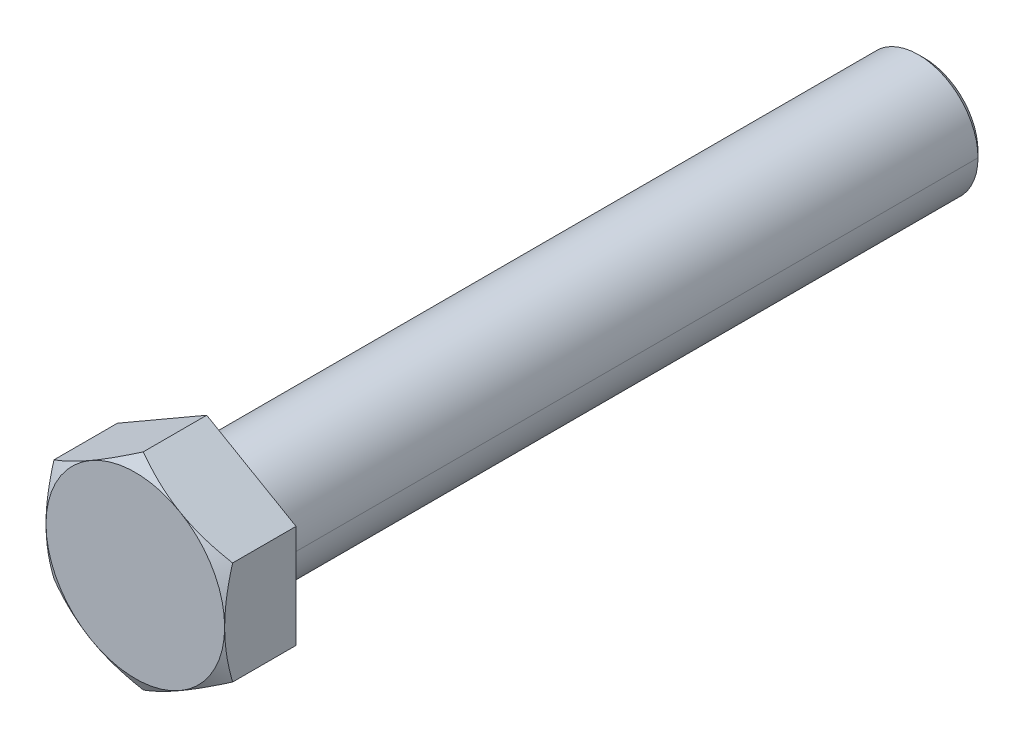
ISO-10303-21;
HEADER;
FILE_DESCRIPTION(('STEP AP214'),'2;1');
FILE_NAME('part.step','',(''),(''),'','','');
FILE_SCHEMA(('AUTOMOTIVE_DESIGN { 1 0 10303 214 1 1 1 1 }'));
ENDSEC;
DATA;
#1=APPLICATION_CONTEXT('core data for automotive mechanical design processes');
#2=APPLICATION_PROTOCOL_DEFINITION('international standard','automotive_design',2000,#1);
#3=PRODUCT_CONTEXT('',#1,'mechanical');
#4=PRODUCT('Part','Part','',(#3));
#5=PRODUCT_RELATED_PRODUCT_CATEGORY('part','',(#4));
#6=PRODUCT_DEFINITION_FORMATION('','',#4);
#7=PRODUCT_DEFINITION_CONTEXT('part definition',#1,'design');
#8=PRODUCT_DEFINITION('design','',#6,#7);
#9=PRODUCT_DEFINITION_SHAPE('','',#8);
#10=(LENGTH_UNIT() NAMED_UNIT(*) SI_UNIT(.MILLI.,.METRE.));
#11=(NAMED_UNIT(*) PLANE_ANGLE_UNIT() SI_UNIT($,.RADIAN.));
#12=(NAMED_UNIT(*) SI_UNIT($,.STERADIAN.) SOLID_ANGLE_UNIT());
#13=UNCERTAINTY_MEASURE_WITH_UNIT(LENGTH_MEASURE(1.E-05),#10,'distance_accuracy_value','');
#14=(GEOMETRIC_REPRESENTATION_CONTEXT(3) GLOBAL_UNCERTAINTY_ASSIGNED_CONTEXT((#13)) GLOBAL_UNIT_ASSIGNED_CONTEXT((#10,
#11,#12)) REPRESENTATION_CONTEXT('',''));
#15=CARTESIAN_POINT('',(0.,0.,0.));
#16=DIRECTION('',(0.,0.,1.));
#17=DIRECTION('',(1.,0.,0.));
#18=AXIS2_PLACEMENT_3D('',#15,#16,#17);
#19=CARTESIAN_POINT('',(0.,0.,4.9609375));
#20=DIRECTION('',(0.,0.,1.));
#21=DIRECTION('',(1.,0.,0.));
#22=AXIS2_PLACEMENT_3D('',#19,#20,#21);
#23=PLANE('',#22);
#24=CARTESIAN_POINT('',(0.,0.,4.96093749999959));
#25=DIRECTION('',(0.,0.,-1.));
#26=DIRECTION('',(-1.,0.,0.));
#27=AXIS2_PLACEMENT_3D('',#24,#25,#26);
#28=CIRCLE('',#27,11.9062499999994);
#29=CARTESIAN_POINT('',(5.95312500053961,10.3111149634961,4.96093749999942));
#30=VERTEX_POINT('',#29);
#31=CARTESIAN_POINT('',(11.90625,-7.6982950199659E-10,4.96093749999941));
#32=VERTEX_POINT('',#31);
#33=EDGE_CURVE('E359',#30,#32,#28,.T.);
#34=ORIENTED_EDGE('',*,*,#33,.F.);
#35=CARTESIAN_POINT('',(0.,0.,4.96093749999922));
#36=DIRECTION('',(0.,0.,-1.));
#37=DIRECTION('',(-1.,0.,0.));
#38=AXIS2_PLACEMENT_3D('',#35,#36,#37);
#39=CIRCLE('',#38,11.90625);
#40=CARTESIAN_POINT('',(-5.95312499930668,10.311114964209,4.96093749999932));
#41=VERTEX_POINT('',#40);
#42=EDGE_CURVE('E358',#41,#30,#39,.T.);
#43=ORIENTED_EDGE('',*,*,#42,.F.);
#44=CARTESIAN_POINT('',(0.,0.,4.96093749999942));
#45=DIRECTION('',(0.,0.,-1.));
#46=DIRECTION('',(-1.,0.,0.));
#47=AXIS2_PLACEMENT_3D('',#44,#45,#46);
#48=CIRCLE('',#47,11.9062499999997);
#49=CARTESIAN_POINT('',(-11.9062499999998,7.69728898675215E-10,4.96093749999951));
#50=VERTEX_POINT('',#49);
#51=EDGE_CURVE('E101',#50,#41,#48,.T.);
#52=ORIENTED_EDGE('',*,*,#51,.F.);
#53=CARTESIAN_POINT('',(0.,0.,4.96093749999959));
#54=DIRECTION('',(0.,0.,-1.));
#55=DIRECTION('',(-1.,0.,0.));
#56=AXIS2_PLACEMENT_3D('',#53,#54,#55);
#57=CIRCLE('',#56,11.9062499999994);
#58=CARTESIAN_POINT('',(-5.95312500053961,-10.3111149634961,4.96093749999942));
#59=VERTEX_POINT('',#58);
#60=EDGE_CURVE('E19',#59,#50,#57,.T.);
#61=ORIENTED_EDGE('',*,*,#60,.F.);
#62=CARTESIAN_POINT('',(0.,0.,4.96093749999922));
#63=DIRECTION('',(0.,0.,-1.));
#64=DIRECTION('',(-1.,0.,0.));
#65=AXIS2_PLACEMENT_3D('',#62,#63,#64);
#66=CIRCLE('',#65,11.90625);
#67=CARTESIAN_POINT('',(5.95312499930667,-10.311114964209,4.96093749999932));
#68=VERTEX_POINT('',#67);
#69=EDGE_CURVE('E98',#68,#59,#66,.T.);
#70=ORIENTED_EDGE('',*,*,#69,.F.);
#71=CARTESIAN_POINT('',(0.,0.,4.96093749999942));
#72=DIRECTION('',(0.,0.,-1.));
#73=DIRECTION('',(-1.,0.,0.));
#74=AXIS2_PLACEMENT_3D('',#71,#72,#73);
#75=CIRCLE('',#74,11.9062499999997);
#76=EDGE_CURVE('E115',#32,#68,#75,.T.);
#77=ORIENTED_EDGE('',*,*,#76,.F.);
#78=EDGE_LOOP('',(#34,#43,#52,#61,#70,#77));
#79=FACE_BOUND('',#78,.T.);
#80=ADVANCED_FACE('F16',(#79),#23,.T.);
#81=CARTESIAN_POINT('',(0.,0.,3.89113360239324));
#82=DIRECTION('',(0.,0.,-1.));
#83=DIRECTION('',(-1.,0.,0.));
#84=AXIS2_PLACEMENT_3D('',#81,#82,#83);
#85=CONICAL_SURFACE('',#84,13.7592047047879,1.0471975511964);
#86=CARTESIAN_POINT('',(-5.95312500107936,-10.3111149631845,4.96093749999962));
#87=CARTESIAN_POINT('',(-6.20580166741517,-10.1652320218576,4.96098646364023));
#88=CARTESIAN_POINT('',(-6.45846630148535,-10.0193560273625,4.95474690052679));
#89=CARTESIAN_POINT('',(-6.96329945909345,-9.72789046792157,4.9300532996241));
#90=CARTESIAN_POINT('',(-7.21546807093537,-9.58230085199346,4.91160167991516));
#91=CARTESIAN_POINT('',(-7.7176800958429,-9.29234860422281,4.86296804461421));
#92=CARTESIAN_POINT('',(-7.96772783267053,-9.14798347605512,4.83284508249774));
#93=CARTESIAN_POINT('',(-8.46663310268567,-8.85994038411174,4.76151221670571));
#94=CARTESIAN_POINT('',(-8.7154906043698,-8.71626243852455,4.72030202120574));
#95=CARTESIAN_POINT('',(-9.21145705677026,-8.42991607372211,4.62763505290839));
#96=CARTESIAN_POINT('',(-9.4585677527614,-8.28724664687198,4.57619068363683));
#97=CARTESIAN_POINT('',(-9.95117990716003,-8.00283688692383,4.46390110400395));
#98=CARTESIAN_POINT('',(-10.1966812665478,-7.8610966109949,4.40305532074512));
#99=CARTESIAN_POINT('',(-10.9330831644665,-7.43593477699972,4.20711782103512));
#100=CARTESIAN_POINT('',(-11.4214457036179,-7.15397853355857,4.05909780005811));
#101=CARTESIAN_POINT('',(-11.90625,-6.87407664253805,3.897514142538));
#102=B_SPLINE_CURVE_WITH_KNOTS('',3,(#86,#87,#88,#89,#90,#91,#92,#93,#94,#95,#96,#97,#98,#99,
#100,#101),.UNSPECIFIED.,.F.,.F.,(4,2,2,2,2,2,2,4),(0.,0.875208645584027,1.75024404500986,
2.6209086587924,3.49159619137232,4.36123483481605,5.23092649267389,6.97885128515324),.UNSPECIFIED.);
#103=CARTESIAN_POINT('',(-11.90625,-6.87407664253804,3.897514142538));
#104=VERTEX_POINT('',#103);
#105=EDGE_CURVE('E117',#59,#104,#102,.T.);
#106=ORIENTED_EDGE('',*,*,#105,.F.);
#107=ORIENTED_EDGE('',*,*,#60,.T.);
#108=CARTESIAN_POINT('',(-11.90625,-6.87407664253803,3.897514142538));
#109=CARTESIAN_POINT('',(-11.90625,-6.31427286030369,4.0590978001139));
#110=CARTESIAN_POINT('',(-11.90625,-5.75036037322509,4.20711782113733));
#111=CARTESIAN_POINT('',(-11.90625,-4.90003670493813,4.40305532089693));
#112=CARTESIAN_POINT('',(-11.90625,-4.61655615298187,4.46390110416884));
#113=CARTESIAN_POINT('',(-11.90625,-4.0477366328877,4.57619068382053));
#114=CARTESIAN_POINT('',(-11.90625,-3.76239777908795,4.62763505309782));
#115=CARTESIAN_POINT('',(-11.90625,-3.18970504928284,4.7203020213985));
#116=CARTESIAN_POINT('',(-11.90625,-2.90234915800772,4.76151221689606));
#117=CARTESIAN_POINT('',(-11.90625,-2.32626297391912,4.83284508267442));
#118=CARTESIAN_POINT('',(-11.90625,-2.03753271748264,4.86296804477964));
#119=CARTESIAN_POINT('',(-11.90625,-1.45762822173761,4.91160168004896));
#120=CARTESIAN_POINT('',(-11.90625,-1.16644898977875,4.93005329973743));
#121=CARTESIAN_POINT('',(-11.90625,-0.583517870692459,4.95474690059005));
#122=CARTESIAN_POINT('',(-11.90625,-0.29176588160037,4.96098646367389));
#123=CARTESIAN_POINT('',(-11.90625,1.15459231980226E-09,4.96093749999923));
#124=B_SPLINE_CURVE_WITH_KNOTS('',3,(#108,#109,#110,#111,#112,#113,#114,#115,#116,#117,#118,
#119,#120,#121,#122,#123),.UNSPECIFIED.,.F.,.F.,(4,2,2,2,2,2,2,4),(0.,1.747924793083,
2.61761645123755,3.48725509497789,4.35794262785571,5.22860724193615,6.10364264166515,
6.97885128755248),.UNSPECIFIED.);
#125=EDGE_CURVE('E120',#104,#50,#124,.T.);
#126=ORIENTED_EDGE('',*,*,#125,.F.);
#127=EDGE_LOOP('',(#106,#107,#126));
#128=FACE_BOUND('',#127,.T.);
#129=ADVANCED_FACE('F118',(#128),#85,.T.);
#130=CARTESIAN_POINT('',(0.,0.,3.89113360239324));
#131=DIRECTION('',(0.,0.,-1.));
#132=DIRECTION('',(-1.,0.,0.));
#133=AXIS2_PLACEMENT_3D('',#130,#131,#132);
#134=CONICAL_SURFACE('',#133,13.7592047047879,1.0471975511964);
#135=CARTESIAN_POINT('',(-11.90625,1.15459230463331E-09,4.96093749999923));
#136=CARTESIAN_POINT('',(-11.90625,0.291765883812283,4.96098646364114));
#137=CARTESIAN_POINT('',(-11.90625,0.583517872806388,4.95474690052883));
#138=CARTESIAN_POINT('',(-11.90625,1.16644899169594,4.93005329962807));
#139=CARTESIAN_POINT('',(-11.90625,1.45762822355605,4.91160167991992));
#140=CARTESIAN_POINT('',(-11.90625,2.03753271910507,4.86296804462019));
#141=CARTESIAN_POINT('',(-11.90625,2.32626297544429,4.83284508250415));
#142=CARTESIAN_POINT('',(-11.90625,2.9023491593387,4.76151221671267));
#143=CARTESIAN_POINT('',(-11.90625,3.18970505051692,4.7203020212128));
#144=CARTESIAN_POINT('',(-11.90625,3.76239778012939,4.62763505291534));
#145=CARTESIAN_POINT('',(-11.90625,4.04773663383342,4.57619068364357));
#146=CARTESIAN_POINT('',(-11.90625,4.61655615373722,4.46390110400999));
#147=CARTESIAN_POINT('',(-11.90625,4.90003670559882,4.40305532075067));
#148=CARTESIAN_POINT('',(-11.90625,5.75036037360042,4.20711782103881));
#149=CARTESIAN_POINT('',(-11.90625,6.31427286049018,4.05909780006006));
#150=CARTESIAN_POINT('',(-11.90625,6.87407664253856,3.89751414253784));
#151=B_SPLINE_CURVE_WITH_KNOTS('',3,(#135,#136,#137,#138,#139,#140,#141,#142,#143,#144,#145,
#146,#147,#148,#149,#150),.UNSPECIFIED.,.F.,.F.,(4,2,2,2,2,2,2,4),(0.,0.875208645595557,
1.75024404503292,2.62090865882677,3.49159619141802,4.36123483487302,5.23092649274215,
6.97885128524444),.UNSPECIFIED.);
#152=CARTESIAN_POINT('',(-11.9062500000002,6.87407664253883,3.89751414253766));
#153=VERTEX_POINT('',#152);
#154=EDGE_CURVE('E242',#50,#153,#151,.T.);
#155=ORIENTED_EDGE('',*,*,#154,.F.);
#156=ORIENTED_EDGE('',*,*,#51,.T.);
#157=CARTESIAN_POINT('',(-11.9062500000004,6.87407664253909,3.89751414253748));
#158=CARTESIAN_POINT('',(-11.4214457034196,7.15397853367432,4.05909780012382));
#159=CARTESIAN_POINT('',(-10.9330831640665,7.43593477723197,4.20711782115595));
#160=CARTESIAN_POINT('',(-10.1966812658429,7.86109661140317,4.40305532092485));
#161=CARTESIAN_POINT('',(-9.95117990635399,8.00283688739049,4.46390110419922));
#162=CARTESIAN_POINT('',(-9.45856775175196,8.28724664745607,4.57619068385444));
#163=CARTESIAN_POINT('',(-9.21145705565854,8.42991607436524,4.62763505313282));
#164=CARTESIAN_POINT('',(-8.71549060305227,8.71626243928651,4.72030202143415));
#165=CARTESIAN_POINT('',(-8.4666331012646,8.85994038493349,4.76151221693127));
#166=CARTESIAN_POINT('',(-7.96772783104199,9.14798347699665,4.83284508270711));
#167=CARTESIAN_POINT('',(-7.71768009411044,9.29234860522434,4.86296804481024));
#168=CARTESIAN_POINT('',(-7.21546806899348,9.5823008531159,4.91160168007369));
#169=CARTESIAN_POINT('',(-6.96329945704606,9.72789046910492,4.93005329975835));
#170=CARTESIAN_POINT('',(-6.45846629922776,10.0193560286672,4.95474690060165));
#171=CARTESIAN_POINT('',(-6.20580166505289,10.1652320232227,4.96098646367998));
#172=CARTESIAN_POINT('',(-5.95312499861315,10.3111149646097,4.96093749999898));
#173=B_SPLINE_CURVE_WITH_KNOTS('',3,(#157,#158,#159,#160,#161,#162,#163,#164,#165,#166,#167,
#168,#169,#170,#171,#172),.UNSPECIFIED.,.F.,.F.,(4,2,2,2,2,2,2,4),(0.,1.74792479319578,
2.61761645140576,3.48725509520151,4.35794262813499,5.22860724227109,6.10364264205672,
6.97885128800072),.UNSPECIFIED.);
#174=EDGE_CURVE('E232',#153,#41,#173,.T.);
#175=ORIENTED_EDGE('',*,*,#174,.F.);
#176=EDGE_LOOP('',(#155,#156,#175));
#177=FACE_BOUND('',#176,.T.);
#178=ADVANCED_FACE('F210',(#177),#134,.T.);
#179=CARTESIAN_POINT('',(0.,0.,3.89113360239275));
#180=DIRECTION('',(0.,0.,-1.));
#181=DIRECTION('',(-1.,0.,0.));
#182=AXIS2_PLACEMENT_3D('',#179,#180,#181);
#183=CONICAL_SURFACE('',#182,13.7592047047888,1.0471975511964);
#184=CARTESIAN_POINT('',(-5.95312499861315,10.3111149646097,4.96093749999898));
#185=CARTESIAN_POINT('',(-5.70044833229031,10.4569979059291,4.96098646363455));
#186=CARTESIAN_POINT('',(-5.44778369823321,10.6028739004167,4.95474690051673));
#187=CARTESIAN_POINT('',(-4.94295054065137,10.8943394598424,4.93005329960663));
#188=CARTESIAN_POINT('',(-4.69078192882264,11.0399290757629,4.91160167989467));
#189=CARTESIAN_POINT('',(-4.18856990394126,11.3298813235185,4.86296804458905));
#190=CARTESIAN_POINT('',(-3.93852216712662,11.4742464516787,4.83284508247092));
#191=CARTESIAN_POINT('',(-3.43961689713739,11.7622895436071,4.76151221667689));
#192=CARTESIAN_POINT('',(-3.1907593954662,11.9059674891868,4.72030202117657));
#193=CARTESIAN_POINT('',(-2.69479294309145,12.1923138539744,4.62763505287974));
#194=CARTESIAN_POINT('',(-2.44768224711308,12.3349832808172,4.57619068360904));
#195=CARTESIAN_POINT('',(-1.95507009273985,12.6193930407506,4.46390110397897));
#196=CARTESIAN_POINT('',(-1.70956873336475,12.7611333166723,4.40305532072209));
#197=CARTESIAN_POINT('',(-0.973166835484058,13.1862951506455,4.20711782101948));
#198=CARTESIAN_POINT('',(-0.484804296357947,13.4682513940721,4.05909780004938));
#199=CARTESIAN_POINT('',(-6.2449626434147E-13,13.7481532850783,3.89751414253755));
#200=B_SPLINE_CURVE_WITH_KNOTS('',3,(#184,#185,#186,#187,#188,#189,#190,#191,#192,#193,#194,
#195,#196,#197,#198,#199),.UNSPECIFIED.,.F.,.F.,(4,2,2,2,2,2,2,4),(0.,0.875208645539062,
1.75024404491995,2.62090865865831,3.49159619119407,4.36123483459382,5.23092649240768,
6.97885128479752),.UNSPECIFIED.);
#201=CARTESIAN_POINT('',(-5.75973932102611E-13,13.7481532850779,3.89751414253773));
#202=VERTEX_POINT('',#201);
#203=EDGE_CURVE('E215',#41,#202,#200,.T.);
#204=ORIENTED_EDGE('',*,*,#203,.F.);
#205=ORIENTED_EDGE('',*,*,#42,.T.);
#206=CARTESIAN_POINT('',(-5.27357445120684E-13,13.7481532850776,3.89751414253791));
#207=CARTESIAN_POINT('',(0.48480429655553,13.4682513939567,4.05909780011602));
#208=CARTESIAN_POINT('',(0.973166835883468,13.1862951504136,4.20711782114129));
#209=CARTESIAN_POINT('',(1.70956873406913,12.7611333162643,4.40305532090288));
#210=CARTESIAN_POINT('',(1.95507009354539,12.6193930402843,4.46390110417532));
#211=CARTESIAN_POINT('',(2.44768224812208,12.3349832802333,4.57619068382778));
#212=CARTESIAN_POINT('',(2.69479294420275,12.1923138533315,4.62763505310532));
#213=CARTESIAN_POINT('',(3.19075939678337,11.905967488425,4.72030202140617));
#214=CARTESIAN_POINT('',(3.43961689855814,11.7622895427855,4.76151221690365));
#215=CARTESIAN_POINT('',(3.9385221687549,11.4742464507373,4.83284508268152));
#216=CARTESIAN_POINT('',(4.18856990567349,11.3298813225171,4.86296804478633));
#217=CARTESIAN_POINT('',(4.69078193076436,11.0399290746406,4.91160168005447));
#218=CARTESIAN_POINT('',(4.94295054269863,10.8943394586591,4.93005329974216));
#219=CARTESIAN_POINT('',(5.44778370049074,10.602873899112,4.95474690059288));
#220=CARTESIAN_POINT('',(5.70044833465256,10.456997904564,4.96098646367559));
#221=CARTESIAN_POINT('',(5.95312500107936,10.3111149631845,4.96093749999962));
#222=B_SPLINE_CURVE_WITH_KNOTS('',3,(#206,#207,#208,#209,#210,#211,#212,#213,#214,#215,#216,
#217,#218,#219,#220,#221),.UNSPECIFIED.,.F.,.F.,(4,2,2,2,2,2,2,4),(0.,1.7479247931065,
2.61761645127261,3.4872550950245,4.35794262791391,5.22860724200596,6.10364264174676,
6.9788512876459),.UNSPECIFIED.);
#223=EDGE_CURVE('E220',#202,#30,#222,.T.);
#224=ORIENTED_EDGE('',*,*,#223,.F.);
#225=EDGE_LOOP('',(#204,#205,#224));
#226=FACE_BOUND('',#225,.T.);
#227=ADVANCED_FACE('F204',(#226),#183,.T.);
#228=CARTESIAN_POINT('',(0.,0.,3.89113360239324));
#229=DIRECTION('',(0.,0.,-1.));
#230=DIRECTION('',(-1.,0.,0.));
#231=AXIS2_PLACEMENT_3D('',#228,#229,#230);
#232=CONICAL_SURFACE('',#231,13.7592047047879,1.0471975511964);
#233=CARTESIAN_POINT('',(5.95312500107936,10.3111149631845,4.96093749999962));
#234=CARTESIAN_POINT('',(6.20580166741517,10.1652320218576,4.96098646364023));
#235=CARTESIAN_POINT('',(6.45846630148535,10.0193560273625,4.95474690052679));
#236=CARTESIAN_POINT('',(6.96329945909345,9.72789046792157,4.9300532996241));
#237=CARTESIAN_POINT('',(7.21546807093537,9.58230085199346,4.91160167991516));
#238=CARTESIAN_POINT('',(7.7176800958429,9.29234860422281,4.86296804461421));
#239=CARTESIAN_POINT('',(7.96772783267053,9.14798347605512,4.83284508249774));
#240=CARTESIAN_POINT('',(8.46663310268567,8.85994038411174,4.76151221670571));
#241=CARTESIAN_POINT('',(8.7154906043698,8.71626243852455,4.72030202120574));
#242=CARTESIAN_POINT('',(9.21145705677026,8.42991607372211,4.62763505290839));
#243=CARTESIAN_POINT('',(9.4585677527614,8.28724664687198,4.57619068363683));
#244=CARTESIAN_POINT('',(9.95117990716003,8.00283688692383,4.46390110400395));
#245=CARTESIAN_POINT('',(10.1966812665478,7.8610966109949,4.40305532074512));
#246=CARTESIAN_POINT('',(10.9330831644665,7.43593477699972,4.20711782103512));
#247=CARTESIAN_POINT('',(11.4214457036179,7.15397853355857,4.05909780005811));
#248=CARTESIAN_POINT('',(11.90625,6.87407664253805,3.897514142538));
#249=B_SPLINE_CURVE_WITH_KNOTS('',3,(#233,#234,#235,#236,#237,#238,#239,#240,#241,#242,#243,
#244,#245,#246,#247,#248),.UNSPECIFIED.,.F.,.F.,(4,2,2,2,2,2,2,4),(0.,0.875208645584027,
1.75024404500986,2.6209086587924,3.49159619137232,4.36123483481605,5.23092649267389,
6.97885128515324),.UNSPECIFIED.);
#250=CARTESIAN_POINT('',(11.90625,6.87407664253804,3.897514142538));
#251=VERTEX_POINT('',#250);
#252=EDGE_CURVE('E195',#30,#251,#249,.T.);
#253=ORIENTED_EDGE('',*,*,#252,.F.);
#254=ORIENTED_EDGE('',*,*,#33,.T.);
#255=CARTESIAN_POINT('',(11.90625,6.87407664253803,3.897514142538));
#256=CARTESIAN_POINT('',(11.90625,6.31427286027267,4.05909780012285));
#257=CARTESIAN_POINT('',(11.90625,5.75036037316257,4.20711782115374));
#258=CARTESIAN_POINT('',(11.90625,4.90003670482802,4.4030553209213));
#259=CARTESIAN_POINT('',(11.90625,4.61655615285598,4.46390110419532));
#260=CARTESIAN_POINT('',(11.90625,4.04773663273005,4.57619068385003));
#261=CARTESIAN_POINT('',(11.90625,3.76239777891434,4.62763505312824));
#262=CARTESIAN_POINT('',(11.90625,3.1897050490771,4.72030202142946));
#263=CARTESIAN_POINT('',(11.90625,2.90234915778581,4.76151221692663));
#264=CARTESIAN_POINT('',(11.90625,2.32626297366482,4.83284508270281));
#265=CARTESIAN_POINT('',(11.90625,2.03753271721212,4.86296804480622));
#266=CARTESIAN_POINT('',(11.90625,1.45762822143439,4.91160168007048));
#267=CARTESIAN_POINT('',(11.90625,1.16644898945906,4.93005329975566));
#268=CARTESIAN_POINT('',(11.90625,0.583517870339958,4.95474690060025));
#269=CARTESIAN_POINT('',(11.90625,0.291765881231527,4.96098646367935));
#270=CARTESIAN_POINT('',(11.90625,-1.53966045812396E-09,4.96093749999923));
#271=B_SPLINE_CURVE_WITH_KNOTS('',3,(#255,#256,#257,#258,#259,#260,#261,#262,#263,#264,#265,
#266,#267,#268,#269,#270),.UNSPECIFIED.,.F.,.F.,(4,2,2,2,2,2,2,4),(0.,1.74792479317986,
2.61761645138202,3.48725509516995,4.35794262809556,5.22860724222381,6.10364264200145,
6.97885128793745),.UNSPECIFIED.);
#272=EDGE_CURVE('E188',#251,#32,#271,.T.);
#273=ORIENTED_EDGE('',*,*,#272,.F.);
#274=EDGE_LOOP('',(#253,#254,#273));
#275=FACE_BOUND('',#274,.T.);
#276=ADVANCED_FACE('F200',(#275),#232,.T.);
#277=CARTESIAN_POINT('',(0.,0.,3.89113360239324));
#278=DIRECTION('',(0.,0.,-1.));
#279=DIRECTION('',(-1.,0.,0.));
#280=AXIS2_PLACEMENT_3D('',#277,#278,#279);
#281=CONICAL_SURFACE('',#280,13.7592047047879,1.0471975511964);
#282=CARTESIAN_POINT('',(11.90625,-1.53965900399318E-09,4.96093749999923));
#283=CARTESIAN_POINT('',(11.90625,-0.291765884181125,4.96098646363568));
#284=CARTESIAN_POINT('',(11.90625,-0.583517873158888,4.95474690051863));
#285=CARTESIAN_POINT('',(11.90625,-1.16644899201563,4.93005329960983));
#286=CARTESIAN_POINT('',(11.90625,-1.45762822385927,4.9116016798984));
#287=CARTESIAN_POINT('',(11.90625,-2.03753271937559,4.8629680445936));
#288=CARTESIAN_POINT('',(11.90625,-2.32626297569859,4.83284508247576));
#289=CARTESIAN_POINT('',(11.90625,-2.90234915956061,4.76151221668209));
#290=CARTESIAN_POINT('',(11.90625,-3.18970505072266,4.72030202118184));
#291=CARTESIAN_POINT('',(11.90625,-3.76239778030301,4.62763505288492));
#292=CARTESIAN_POINT('',(11.90625,-4.04773663399107,4.57619068361407));
#293=CARTESIAN_POINT('',(11.90625,-4.61655615386312,4.46390110398352));
#294=CARTESIAN_POINT('',(11.90625,-4.90003670570894,4.4030553207263));
#295=CARTESIAN_POINT('',(11.90625,-5.75036037366294,4.2071178210224));
#296=CARTESIAN_POINT('',(11.90625,-6.31427286052119,4.05909780005111));
#297=CARTESIAN_POINT('',(11.90625,-6.87407664253856,3.89751414253784));
#298=B_SPLINE_CURVE_WITH_KNOTS('',3,(#282,#283,#284,#285,#286,#287,#288,#289,#290,#291,#292,
#293,#294,#295,#296,#297),.UNSPECIFIED.,.F.,.F.,(4,2,2,2,2,2,2,4),(0.,0.875208645546891,
1.75024404493561,2.62090865868166,3.49159619122511,4.36123483463252,5.23092649245404,
6.97885128485947),.UNSPECIFIED.);
#299=CARTESIAN_POINT('',(11.9062500000002,-6.87407664253883,3.89751414253766));
#300=VERTEX_POINT('',#299);
#301=EDGE_CURVE('E183',#32,#300,#298,.T.);
#302=ORIENTED_EDGE('',*,*,#301,.F.);
#303=ORIENTED_EDGE('',*,*,#76,.T.);
#304=CARTESIAN_POINT('',(11.9062500000004,-6.87407664253909,3.89751414253748));
#305=CARTESIAN_POINT('',(11.4214457034196,-7.15397853367432,4.05909780012382));
#306=CARTESIAN_POINT('',(10.9330831640665,-7.43593477723197,4.20711782115595));
#307=CARTESIAN_POINT('',(10.1966812658429,-7.86109661140317,4.40305532092485));
#308=CARTESIAN_POINT('',(9.95117990635399,-8.00283688739049,4.46390110419922));
#309=CARTESIAN_POINT('',(9.45856775175196,-8.28724664745607,4.57619068385444));
#310=CARTESIAN_POINT('',(9.21145705565854,-8.42991607436524,4.62763505313282));
#311=CARTESIAN_POINT('',(8.71549060305227,-8.71626243928651,4.72030202143415));
#312=CARTESIAN_POINT('',(8.4666331012646,-8.85994038493349,4.76151221693127));
#313=CARTESIAN_POINT('',(7.96772783104198,-9.14798347699665,4.83284508270711));
#314=CARTESIAN_POINT('',(7.71768009411044,-9.29234860522434,4.86296804481024));
#315=CARTESIAN_POINT('',(7.21546806899348,-9.5823008531159,4.91160168007369));
#316=CARTESIAN_POINT('',(6.96329945704606,-9.72789046910492,4.93005329975835));
#317=CARTESIAN_POINT('',(6.45846629922776,-10.0193560286672,4.95474690060165));
#318=CARTESIAN_POINT('',(6.20580166505289,-10.1652320232227,4.96098646367999));
#319=CARTESIAN_POINT('',(5.95312499861315,-10.3111149646097,4.96093749999898));
#320=B_SPLINE_CURVE_WITH_KNOTS('',3,(#304,#305,#306,#307,#308,#309,#310,#311,#312,#313,#314,
#315,#316,#317,#318,#319),.UNSPECIFIED.,.F.,.F.,(4,2,2,2,2,2,2,4),(0.,1.74792479319578,
2.61761645140576,3.48725509520152,4.35794262813499,5.22860724227109,6.10364264205673,
6.97885128800072),.UNSPECIFIED.);
#321=EDGE_CURVE('E158',#300,#68,#320,.T.);
#322=ORIENTED_EDGE('',*,*,#321,.F.);
#323=EDGE_LOOP('',(#302,#303,#322));
#324=FACE_BOUND('',#323,.T.);
#325=ADVANCED_FACE('F146',(#324),#281,.T.);
#326=CARTESIAN_POINT('',(0.,0.,3.89113360239275));
#327=DIRECTION('',(0.,0.,-1.));
#328=DIRECTION('',(-1.,0.,0.));
#329=AXIS2_PLACEMENT_3D('',#326,#327,#328);
#330=CONICAL_SURFACE('',#329,13.7592047047888,1.0471975511964);
#331=CARTESIAN_POINT('',(5.95312499861314,-10.3111149646097,4.96093749999898));
#332=CARTESIAN_POINT('',(5.7004483322903,-10.4569979059291,4.96098646363455));
#333=CARTESIAN_POINT('',(5.4477836982332,-10.6028739004167,4.95474690051673));
#334=CARTESIAN_POINT('',(4.94295054065134,-10.8943394598424,4.93005329960663));
#335=CARTESIAN_POINT('',(4.6907819288226,-11.0399290757629,4.91160167989467));
#336=CARTESIAN_POINT('',(4.18856990394121,-11.3298813235185,4.86296804458904));
#337=CARTESIAN_POINT('',(3.93852216712656,-11.4742464516787,4.83284508247091));
#338=CARTESIAN_POINT('',(3.43961689713732,-11.7622895436071,4.76151221667688));
#339=CARTESIAN_POINT('',(3.19075939546612,-11.9059674891868,4.72030202117656));
#340=CARTESIAN_POINT('',(2.69479294309136,-12.1923138539744,4.62763505287972));
#341=CARTESIAN_POINT('',(2.44768224711299,-12.3349832808172,4.57619068360902));
#342=CARTESIAN_POINT('',(1.95507009273975,-12.6193930407507,4.46390110397894));
#343=CARTESIAN_POINT('',(1.70956873336463,-12.7611333166723,4.40305532072206));
#344=CARTESIAN_POINT('',(0.973166835483929,-13.1862951506455,4.20711782101944));
#345=CARTESIAN_POINT('',(0.484804296357806,-13.4682513940721,4.05909780004933));
#346=CARTESIAN_POINT('',(4.711339800677E-13,-13.7481532850783,3.8975141425375));
#347=B_SPLINE_CURVE_WITH_KNOTS('',3,(#331,#332,#333,#334,#335,#336,#337,#338,#339,#340,#341,
#342,#343,#344,#345,#346),.UNSPECIFIED.,.F.,.F.,(4,2,2,2,2,2,2,4),(0.,0.875208645539083,
1.75024404491999,2.62090865865838,3.49159619119416,4.36123483459394,5.23092649240781,
6.9788512847977),.UNSPECIFIED.);
#348=CARTESIAN_POINT('',(2.63542296623728E-13,-13.7481532850781,3.89751414253763));
#349=VERTEX_POINT('',#348);
#350=EDGE_CURVE('E113',#68,#349,#347,.T.);
#351=ORIENTED_EDGE('',*,*,#350,.F.);
#352=ORIENTED_EDGE('',*,*,#69,.T.);
#353=CARTESIAN_POINT('',(5.27379340643689E-13,-13.7481532850776,3.89751414253791));
#354=CARTESIAN_POINT('',(-0.48480429655553,-13.4682513939567,4.05909780011602));
#355=CARTESIAN_POINT('',(-0.973166835883468,-13.1862951504136,4.20711782114129));
#356=CARTESIAN_POINT('',(-1.70956873406913,-12.7611333162643,4.40305532090288));
#357=CARTESIAN_POINT('',(-1.95507009354539,-12.6193930402843,4.46390110417532));
#358=CARTESIAN_POINT('',(-2.44768224812208,-12.3349832802333,4.57619068382778));
#359=CARTESIAN_POINT('',(-2.69479294420275,-12.1923138533315,4.62763505310532));
#360=CARTESIAN_POINT('',(-3.19075939678337,-11.905967488425,4.72030202140617));
#361=CARTESIAN_POINT('',(-3.43961689855814,-11.7622895427855,4.76151221690365));
#362=CARTESIAN_POINT('',(-3.9385221687549,-11.4742464507373,4.83284508268152));
#363=CARTESIAN_POINT('',(-4.18856990567349,-11.3298813225171,4.86296804478633));
#364=CARTESIAN_POINT('',(-4.69078193076436,-11.0399290746406,4.91160168005447));
#365=CARTESIAN_POINT('',(-4.94295054269863,-10.8943394586591,4.93005329974216));
#366=CARTESIAN_POINT('',(-5.44778370049074,-10.602873899112,4.95474690059288));
#367=CARTESIAN_POINT('',(-5.70044833465256,-10.456997904564,4.96098646367559));
#368=CARTESIAN_POINT('',(-5.95312500107936,-10.3111149631845,4.96093749999962));
#369=B_SPLINE_CURVE_WITH_KNOTS('',3,(#353,#354,#355,#356,#357,#358,#359,#360,#361,#362,#363,
#364,#365,#366,#367,#368),.UNSPECIFIED.,.F.,.F.,(4,2,2,2,2,2,2,4),(0.,1.74792479310651,
2.61761645127261,3.4872550950245,4.35794262791392,5.22860724200596,6.10364264174676,
6.9788512876459),.UNSPECIFIED.);
#370=EDGE_CURVE('E110',#349,#59,#369,.T.);
#371=ORIENTED_EDGE('',*,*,#370,.F.);
#372=EDGE_LOOP('',(#351,#352,#371));
#373=FACE_BOUND('',#372,.T.);
#374=ADVANCED_FACE('F108',(#373),#330,.T.);
#375=CARTESIAN_POINT('',(-11.90625,-6.87407664253804,-4.9609375));
#376=DIRECTION('',(-0.500000000000017,-0.866025403784429,0.));
#377=DIRECTION('',(0.866025403784429,-0.500000000000017,0.));
#378=AXIS2_PLACEMENT_3D('',#375,#376,#377);
#379=PLANE('',#378);
#380=ORIENTED_EDGE('',*,*,#370,.T.);
#381=ORIENTED_EDGE('',*,*,#105,.T.);
#382=DIRECTION('',(0.,0.,1.));
#383=VECTOR('',#382,1.);
#384=CARTESIAN_POINT('',(-11.90625,-6.87407664253804,-4.9609375));
#385=LINE('',#384,#383);
#386=CARTESIAN_POINT('',(-11.90625,-6.87407664253804,-4.5545375));
#387=VERTEX_POINT('',#386);
#388=EDGE_CURVE('E124',#387,#104,#385,.T.);
#389=ORIENTED_EDGE('',*,*,#388,.F.);
#390=DIRECTION('',(-0.866025403784388,0.500000000000087,0.));
#391=VECTOR('',#390,1.);
#392=CARTESIAN_POINT('',(0.,-13.7481532850786,-4.5545375));
#393=LINE('',#392,#391);
#394=CARTESIAN_POINT('',(2.09901540593194E-13,-13.7481532850785,-4.5545375));
#395=VERTEX_POINT('',#394);
#396=EDGE_CURVE('E157',#395,#387,#393,.T.);
#397=ORIENTED_EDGE('',*,*,#396,.F.);
#398=DIRECTION('',(0.,0.,1.));
#399=VECTOR('',#398,1.);
#400=CARTESIAN_POINT('',(0.,-13.7481532850786,-4.9609375));
#401=LINE('',#400,#399);
#402=EDGE_CURVE('E129',#349,#395,#401,.F.);
#403=ORIENTED_EDGE('',*,*,#402,.F.);
#404=EDGE_LOOP('',(#380,#381,#389,#397,#403));
#405=FACE_BOUND('',#404,.T.);
#406=ADVANCED_FACE('F126',(#405),#379,.T.);
#407=CARTESIAN_POINT('',(-11.90625,6.87407664253804,-4.9609375));
#408=DIRECTION('',(-1.,0.,0.));
#409=DIRECTION('',(0.,0.,1.));
#410=AXIS2_PLACEMENT_3D('',#407,#408,#409);
#411=PLANE('',#410);
#412=ORIENTED_EDGE('',*,*,#125,.T.);
#413=ORIENTED_EDGE('',*,*,#154,.T.);
#414=DIRECTION('',(0.,0.,1.));
#415=VECTOR('',#414,1.);
#416=CARTESIAN_POINT('',(-11.9062500000006,6.87407664253901,-4.9609375));
#417=LINE('',#416,#415);
#418=CARTESIAN_POINT('',(-11.9062500000003,6.87407664253852,-4.5545375));
#419=VERTEX_POINT('',#418);
#420=EDGE_CURVE('E239',#419,#153,#417,.T.);
#421=ORIENTED_EDGE('',*,*,#420,.F.);
#422=DIRECTION('',(0.,1.,0.));
#423=VECTOR('',#422,1.);
#424=CARTESIAN_POINT('',(-11.90625,0.,-4.5545375));
#425=LINE('',#424,#423);
#426=EDGE_CURVE('E261',#387,#419,#425,.T.);
#427=ORIENTED_EDGE('',*,*,#426,.F.);
#428=ORIENTED_EDGE('',*,*,#388,.T.);
#429=EDGE_LOOP('',(#412,#413,#421,#427,#428));
#430=FACE_BOUND('',#429,.T.);
#431=ADVANCED_FACE('F369',(#430),#411,.T.);
#432=CARTESIAN_POINT('',(0.,13.7481532850786,-4.9609375));
#433=DIRECTION('',(-0.500000000000017,0.866025403784429,0.));
#434=DIRECTION('',(-0.866025403784429,-0.500000000000017,0.));
#435=AXIS2_PLACEMENT_3D('',#432,#433,#434);
#436=PLANE('',#435);
#437=ORIENTED_EDGE('',*,*,#174,.T.);
#438=ORIENTED_EDGE('',*,*,#203,.T.);
#439=DIRECTION('',(0.,0.,1.));
#440=VECTOR('',#439,1.);
#441=CARTESIAN_POINT('',(-5.58580959264532E-13,13.7481532850777,-4.9609375));
#442=LINE('',#441,#440);
#443=CARTESIAN_POINT('',(-2.79344921220457E-13,13.7481532850781,-4.5545375));
#444=VERTEX_POINT('',#443);
#445=EDGE_CURVE('E225',#444,#202,#442,.T.);
#446=ORIENTED_EDGE('',*,*,#445,.F.);
#447=DIRECTION('',(0.866025403784388,0.500000000000087,0.));
#448=VECTOR('',#447,1.);
#449=CARTESIAN_POINT('',(-11.90625,6.87407664253804,-4.5545375));
#450=LINE('',#449,#448);
#451=EDGE_CURVE('E266',#419,#444,#450,.T.);
#452=ORIENTED_EDGE('',*,*,#451,.F.);
#453=ORIENTED_EDGE('',*,*,#420,.T.);
#454=EDGE_LOOP('',(#437,#438,#446,#452,#453));
#455=FACE_BOUND('',#454,.T.);
#456=ADVANCED_FACE('F354',(#455),#436,.T.);
#457=CARTESIAN_POINT('',(11.90625,6.87407664253804,-4.9609375));
#458=DIRECTION('',(0.500000000000017,0.866025403784429,0.));
#459=DIRECTION('',(-0.866025403784429,0.500000000000017,0.));
#460=AXIS2_PLACEMENT_3D('',#457,#458,#459);
#461=PLANE('',#460);
#462=ORIENTED_EDGE('',*,*,#223,.T.);
#463=ORIENTED_EDGE('',*,*,#252,.T.);
#464=DIRECTION('',(0.,0.,-1.));
#465=VECTOR('',#464,1.);
#466=CARTESIAN_POINT('',(11.90625,6.87407664253804,-4.9609375));
#467=LINE('',#466,#465);
#468=CARTESIAN_POINT('',(11.90625,6.87407664253804,-4.5545375));
#469=VERTEX_POINT('',#468);
#470=EDGE_CURVE('E194',#469,#251,#467,.F.);
#471=ORIENTED_EDGE('',*,*,#470,.F.);
#472=DIRECTION('',(0.866025403784388,-0.500000000000087,0.));
#473=VECTOR('',#472,1.);
#474=CARTESIAN_POINT('',(0.,13.7481532850786,-4.5545375));
#475=LINE('',#474,#473);
#476=EDGE_CURVE('E256',#444,#469,#475,.T.);
#477=ORIENTED_EDGE('',*,*,#476,.F.);
#478=ORIENTED_EDGE('',*,*,#445,.T.);
#479=EDGE_LOOP('',(#462,#463,#471,#477,#478));
#480=FACE_BOUND('',#479,.T.);
#481=ADVANCED_FACE('F178',(#480),#461,.T.);
#482=CARTESIAN_POINT('',(11.90625,-6.87407664253804,-4.9609375));
#483=DIRECTION('',(1.,0.,0.));
#484=DIRECTION('',(0.,0.,-1.));
#485=AXIS2_PLACEMENT_3D('',#482,#483,#484);
#486=PLANE('',#485);
#487=ORIENTED_EDGE('',*,*,#272,.T.);
#488=ORIENTED_EDGE('',*,*,#301,.T.);
#489=DIRECTION('',(0.,0.,1.));
#490=VECTOR('',#489,1.);
#491=CARTESIAN_POINT('',(11.9062500000006,-6.87407664253901,-4.9609375));
#492=LINE('',#491,#490);
#493=CARTESIAN_POINT('',(11.9062500000006,-6.87407664253901,-4.5545375));
#494=VERTEX_POINT('',#493);
#495=EDGE_CURVE('E325',#494,#300,#492,.T.);
#496=ORIENTED_EDGE('',*,*,#495,.F.);
#497=DIRECTION('',(0.,1.,0.));
#498=VECTOR('',#497,1.);
#499=CARTESIAN_POINT('',(11.90625,0.,-4.5545375));
#500=LINE('',#499,#498);
#501=EDGE_CURVE('E251',#469,#494,#500,.F.);
#502=ORIENTED_EDGE('',*,*,#501,.F.);
#503=ORIENTED_EDGE('',*,*,#470,.T.);
#504=EDGE_LOOP('',(#487,#488,#496,#502,#503));
#505=FACE_BOUND('',#504,.T.);
#506=ADVANCED_FACE('F171',(#505),#486,.T.);
#507=CARTESIAN_POINT('',(0.,-13.7481532850786,-4.9609375));
#508=DIRECTION('',(0.500000000000017,-0.866025403784429,0.));
#509=DIRECTION('',(0.866025403784429,0.500000000000017,0.));
#510=AXIS2_PLACEMENT_3D('',#507,#508,#509);
#511=PLANE('',#510);
#512=ORIENTED_EDGE('',*,*,#321,.T.);
#513=ORIENTED_EDGE('',*,*,#350,.T.);
#514=ORIENTED_EDGE('',*,*,#402,.T.);
#515=DIRECTION('',(-0.866025403784388,-0.500000000000087,0.));
#516=VECTOR('',#515,1.);
#517=CARTESIAN_POINT('',(11.90625,-6.87407664253804,-4.5545375));
#518=LINE('',#517,#516);
#519=EDGE_CURVE('E248',#494,#395,#518,.T.);
#520=ORIENTED_EDGE('',*,*,#519,.F.);
#521=ORIENTED_EDGE('',*,*,#495,.T.);
#522=EDGE_LOOP('',(#512,#513,#514,#520,#521));
#523=FACE_BOUND('',#522,.T.);
#524=ADVANCED_FACE('F165',(#523),#511,.T.);
#525=CARTESIAN_POINT('',(0.,0.,-4.5545375));
#526=DIRECTION('',(0.,0.,-1.));
#527=DIRECTION('',(-1.,0.,0.));
#528=AXIS2_PLACEMENT_3D('',#525,#526,#527);
#529=PLANE('',#528);
#530=CARTESIAN_POINT('',(0.,0.,-4.5545375));
#531=DIRECTION('',(0.,0.,-1.));
#532=DIRECTION('',(-1.,0.,0.));
#533=AXIS2_PLACEMENT_3D('',#530,#531,#532);
#534=CIRCLE('',#533,11.3109375);
#535=CARTESIAN_POINT('',(0.,-11.3109375,-4.5545375));
#536=VERTEX_POINT('',#535);
#537=CARTESIAN_POINT('',(0.,11.3109375,-4.5545375));
#538=VERTEX_POINT('',#537);
#539=EDGE_CURVE('E290',#536,#538,#534,.T.);
#540=ORIENTED_EDGE('',*,*,#539,.F.);
#541=CARTESIAN_POINT('',(0.,0.,-4.5545375));
#542=DIRECTION('',(0.,0.,-1.));
#543=DIRECTION('',(-1.,0.,0.));
#544=AXIS2_PLACEMENT_3D('',#541,#542,#543);
#545=CIRCLE('',#544,11.3109375);
#546=EDGE_CURVE('E294',#538,#536,#545,.T.);
#547=ORIENTED_EDGE('',*,*,#546,.F.);
#548=EDGE_LOOP('',(#540,#547));
#549=FACE_BOUND('',#548,.T.);
#550=ORIENTED_EDGE('',*,*,#501,.T.);
#551=ORIENTED_EDGE('',*,*,#519,.T.);
#552=ORIENTED_EDGE('',*,*,#396,.T.);
#553=ORIENTED_EDGE('',*,*,#426,.T.);
#554=ORIENTED_EDGE('',*,*,#451,.T.);
#555=ORIENTED_EDGE('',*,*,#476,.T.);
#556=EDGE_LOOP('',(#550,#551,#552,#553,#554,#555));
#557=FACE_BOUND('',#556,.T.);
#558=ADVANCED_FACE('F170',(#549,#557),#529,.T.);
#559=CARTESIAN_POINT('',(0.,0.,-100.2109375));
#560=DIRECTION('',(0.,0.,-1.));
#561=DIRECTION('',(-1.,0.,0.));
#562=AXIS2_PLACEMENT_3D('',#559,#560,#561);
#563=PLANE('',#562);
#564=CARTESIAN_POINT('',(0.,0.,-100.2109375));
#565=DIRECTION('',(0.,0.,1.));
#566=DIRECTION('',(1.,0.,0.));
#567=AXIS2_PLACEMENT_3D('',#564,#565,#566);
#568=CIRCLE('',#567,7.15010000000006);
#569=CARTESIAN_POINT('',(7.15010000000006,0.,-100.2109375));
#570=VERTEX_POINT('',#569);
#571=CARTESIAN_POINT('',(-7.15010000000006,0.,-100.2109375));
#572=VERTEX_POINT('',#571);
#573=EDGE_CURVE('E285',#570,#572,#568,.T.);
#574=ORIENTED_EDGE('',*,*,#573,.F.);
#575=CARTESIAN_POINT('',(0.,0.,-100.2109375));
#576=DIRECTION('',(0.,0.,1.));
#577=DIRECTION('',(1.,0.,0.));
#578=AXIS2_PLACEMENT_3D('',#575,#576,#577);
#579=CIRCLE('',#578,7.15010000000006);
#580=EDGE_CURVE('E159',#572,#570,#579,.T.);
#581=ORIENTED_EDGE('',*,*,#580,.F.);
#582=EDGE_LOOP('',(#574,#581));
#583=FACE_BOUND('',#582,.T.);
#584=ADVANCED_FACE('F309',(#583),#563,.T.);
#585=CARTESIAN_POINT('',(0.,0.,-99.4235374999999));
#586=DIRECTION('',(0.,0.,1.));
#587=DIRECTION('',(1.,0.,0.));
#588=AXIS2_PLACEMENT_3D('',#585,#586,#587);
#589=CONICAL_SURFACE('',#588,7.93749999999995,0.7853981633973);
#590=CARTESIAN_POINT('',(0.,0.,-99.4235375));
#591=DIRECTION('',(0.,0.,-1.));
#592=DIRECTION('',(-1.,0.,0.));
#593=AXIS2_PLACEMENT_3D('',#590,#591,#592);
#594=CIRCLE('',#593,7.9375);
#595=CARTESIAN_POINT('',(-7.93749999999999,0.,-99.4235375));
#596=VERTEX_POINT('',#595);
#597=CARTESIAN_POINT('',(7.93749999999999,0.,-99.4235375));
#598=VERTEX_POINT('',#597);
#599=EDGE_CURVE('E284',#596,#598,#594,.F.);
#600=ORIENTED_EDGE('',*,*,#599,.F.);
#601=DIRECTION('',(0.707106781186443,0.,-0.707106781186652));
#602=VECTOR('',#601,1.);
#603=CARTESIAN_POINT('',(-7.5438,0.,-99.8172375));
#604=LINE('',#603,#602);
#605=EDGE_CURVE('E288',#572,#596,#604,.F.);
#606=ORIENTED_EDGE('',*,*,#605,.F.);
#607=ORIENTED_EDGE('',*,*,#580,.T.);
#608=DIRECTION('',(-0.707106781186443,0.,-0.707106781186652));
#609=VECTOR('',#608,1.);
#610=CARTESIAN_POINT('',(7.5438,0.,-99.8172375));
#611=LINE('',#610,#609);
#612=EDGE_CURVE('E289',#598,#570,#611,.T.);
#613=ORIENTED_EDGE('',*,*,#612,.F.);
#614=EDGE_LOOP('',(#600,#606,#607,#613));
#615=FACE_BOUND('',#614,.T.);
#616=ADVANCED_FACE('F304',(#615),#589,.T.);
#617=CARTESIAN_POINT('',(0.,0.,-4.9609375));
#618=DIRECTION('',(0.,0.,-1.));
#619=DIRECTION('',(-1.,0.,0.));
#620=AXIS2_PLACEMENT_3D('',#617,#618,#619);
#621=CYLINDRICAL_SURFACE('',#620,11.3109375);
#622=DIRECTION('',(0.,0.,-1.));
#623=VECTOR('',#622,1.);
#624=CARTESIAN_POINT('',(0.,-11.3109375,-4.9609375));
#625=LINE('',#624,#623);
#626=CARTESIAN_POINT('',(0.,-11.3109375,-4.9609375));
#627=VERTEX_POINT('',#626);
#628=EDGE_CURVE('E293',#627,#536,#625,.F.);
#629=ORIENTED_EDGE('',*,*,#628,.F.);
#630=CARTESIAN_POINT('',(0.,0.,-4.9609375));
#631=DIRECTION('',(0.,0.,-1.));
#632=DIRECTION('',(-1.,0.,0.));
#633=AXIS2_PLACEMENT_3D('',#630,#631,#632);
#634=CIRCLE('',#633,11.3109375);
#635=CARTESIAN_POINT('',(0.,11.3109375,-4.9609375));
#636=VERTEX_POINT('',#635);
#637=EDGE_CURVE('E282',#627,#636,#634,.F.);
#638=ORIENTED_EDGE('',*,*,#637,.T.);
#639=DIRECTION('',(0.,0.,-1.));
#640=VECTOR('',#639,1.);
#641=CARTESIAN_POINT('',(0.,11.3109375,-4.9609375));
#642=LINE('',#641,#640);
#643=EDGE_CURVE('E292',#538,#636,#642,.T.);
#644=ORIENTED_EDGE('',*,*,#643,.F.);
#645=ORIENTED_EDGE('',*,*,#546,.T.);
#646=EDGE_LOOP('',(#629,#638,#644,#645));
#647=FACE_BOUND('',#646,.T.);
#648=ADVANCED_FACE('F405',(#647),#621,.T.);
#649=CARTESIAN_POINT('',(0.,0.,-4.9609375));
#650=DIRECTION('',(0.,0.,-1.));
#651=DIRECTION('',(-1.,0.,0.));
#652=AXIS2_PLACEMENT_3D('',#649,#650,#651);
#653=CYLINDRICAL_SURFACE('',#652,11.3109375);
#654=ORIENTED_EDGE('',*,*,#643,.T.);
#655=CARTESIAN_POINT('',(0.,0.,-4.9609375));
#656=DIRECTION('',(0.,0.,-1.));
#657=DIRECTION('',(-1.,0.,0.));
#658=AXIS2_PLACEMENT_3D('',#655,#656,#657);
#659=CIRCLE('',#658,11.3109375);
#660=EDGE_CURVE('E279',#636,#627,#659,.F.);
#661=ORIENTED_EDGE('',*,*,#660,.T.);
#662=ORIENTED_EDGE('',*,*,#628,.T.);
#663=ORIENTED_EDGE('',*,*,#539,.T.);
#664=EDGE_LOOP('',(#654,#661,#662,#663));
#665=FACE_BOUND('',#664,.T.);
#666=ADVANCED_FACE('F402',(#665),#653,.T.);
#667=CARTESIAN_POINT('',(0.,0.,-99.4235374999999));
#668=DIRECTION('',(0.,0.,1.));
#669=DIRECTION('',(1.,0.,0.));
#670=AXIS2_PLACEMENT_3D('',#667,#668,#669);
#671=CONICAL_SURFACE('',#670,7.93749999999995,0.7853981633973);
#672=ORIENTED_EDGE('',*,*,#573,.T.);
#673=ORIENTED_EDGE('',*,*,#605,.T.);
#674=CARTESIAN_POINT('',(0.,0.,-99.4235375));
#675=DIRECTION('',(0.,0.,-1.));
#676=DIRECTION('',(-1.,0.,0.));
#677=AXIS2_PLACEMENT_3D('',#674,#675,#676);
#678=CIRCLE('',#677,7.9375);
#679=EDGE_CURVE('E314',#598,#596,#678,.F.);
#680=ORIENTED_EDGE('',*,*,#679,.F.);
#681=ORIENTED_EDGE('',*,*,#612,.T.);
#682=EDGE_LOOP('',(#672,#673,#680,#681));
#683=FACE_BOUND('',#682,.T.);
#684=ADVANCED_FACE('F312',(#683),#671,.T.);
#685=CARTESIAN_POINT('',(0.,0.,-0.1984375));
#686=DIRECTION('',(0.,0.,-1.));
#687=DIRECTION('',(-1.,0.,0.));
#688=AXIS2_PLACEMENT_3D('',#685,#686,#687);
#689=CYLINDRICAL_SURFACE('',#688,7.9375);
#690=DIRECTION('',(0.,0.,-1.));
#691=VECTOR('',#690,1.);
#692=CARTESIAN_POINT('',(7.9375,0.,-0.1984375));
#693=LINE('',#692,#691);
#694=CARTESIAN_POINT('',(7.9375,0.,-4.9609375));
#695=VERTEX_POINT('',#694);
#696=EDGE_CURVE('E278',#695,#598,#693,.T.);
#697=ORIENTED_EDGE('',*,*,#696,.F.);
#698=CARTESIAN_POINT('',(0.,0.,-4.9609375));
#699=DIRECTION('',(0.,0.,-1.));
#700=DIRECTION('',(-1.,0.,0.));
#701=AXIS2_PLACEMENT_3D('',#698,#699,#700);
#702=CIRCLE('',#701,7.9375);
#703=CARTESIAN_POINT('',(-7.9375,0.,-4.9609375));
#704=VERTEX_POINT('',#703);
#705=EDGE_CURVE('E34',#695,#704,#702,.T.);
#706=ORIENTED_EDGE('',*,*,#705,.T.);
#707=DIRECTION('',(0.,0.,-1.));
#708=VECTOR('',#707,1.);
#709=CARTESIAN_POINT('',(-7.9375,0.,-0.1984375));
#710=LINE('',#709,#708);
#711=EDGE_CURVE('E25',#596,#704,#710,.F.);
#712=ORIENTED_EDGE('',*,*,#711,.F.);
#713=ORIENTED_EDGE('',*,*,#599,.T.);
#714=EDGE_LOOP('',(#697,#706,#712,#713));
#715=FACE_BOUND('',#714,.T.);
#716=ADVANCED_FACE('F393',(#715),#689,.T.);
#717=CARTESIAN_POINT('',(0.,0.,-4.9609375));
#718=DIRECTION('',(0.,0.,1.));
#719=DIRECTION('',(1.,0.,0.));
#720=AXIS2_PLACEMENT_3D('',#717,#718,#719);
#721=PLANE('',#720);
#722=CARTESIAN_POINT('',(0.,0.,-4.9609375));
#723=DIRECTION('',(0.,0.,-1.));
#724=DIRECTION('',(-1.,0.,0.));
#725=AXIS2_PLACEMENT_3D('',#722,#723,#724);
#726=CIRCLE('',#725,7.9375);
#727=EDGE_CURVE('E11',#704,#695,#726,.T.);
#728=ORIENTED_EDGE('',*,*,#727,.F.);
#729=ORIENTED_EDGE('',*,*,#705,.F.);
#730=EDGE_LOOP('',(#728,#729));
#731=FACE_BOUND('',#730,.T.);
#732=ORIENTED_EDGE('',*,*,#637,.F.);
#733=ORIENTED_EDGE('',*,*,#660,.F.);
#734=EDGE_LOOP('',(#732,#733));
#735=FACE_BOUND('',#734,.T.);
#736=ADVANCED_FACE('F387',(#731,#735),#721,.F.);
#737=CARTESIAN_POINT('',(0.,0.,-0.1984375));
#738=DIRECTION('',(0.,0.,-1.));
#739=DIRECTION('',(-1.,0.,0.));
#740=AXIS2_PLACEMENT_3D('',#737,#738,#739);
#741=CYLINDRICAL_SURFACE('',#740,7.9375);
#742=ORIENTED_EDGE('',*,*,#711,.T.);
#743=ORIENTED_EDGE('',*,*,#727,.T.);
#744=ORIENTED_EDGE('',*,*,#696,.T.);
#745=ORIENTED_EDGE('',*,*,#679,.T.);
#746=EDGE_LOOP('',(#742,#743,#744,#745));
#747=FACE_BOUND('',#746,.T.);
#748=ADVANCED_FACE('F385',(#747),#741,.T.);
#749=CLOSED_SHELL('',(#80,#129,#178,#227,#276,#325,#374,#406,#431,#456,#481,#506,#524,#558,#584,
#616,#648,#666,#684,#716,#736,#748));
#750=MANIFOLD_SOLID_BREP('B1',#749);
#751=ADVANCED_BREP_SHAPE_REPRESENTATION('',(#18,#750),#14);
#752=SHAPE_DEFINITION_REPRESENTATION(#9,#751);
ENDSEC;
END-ISO-10303-21;
